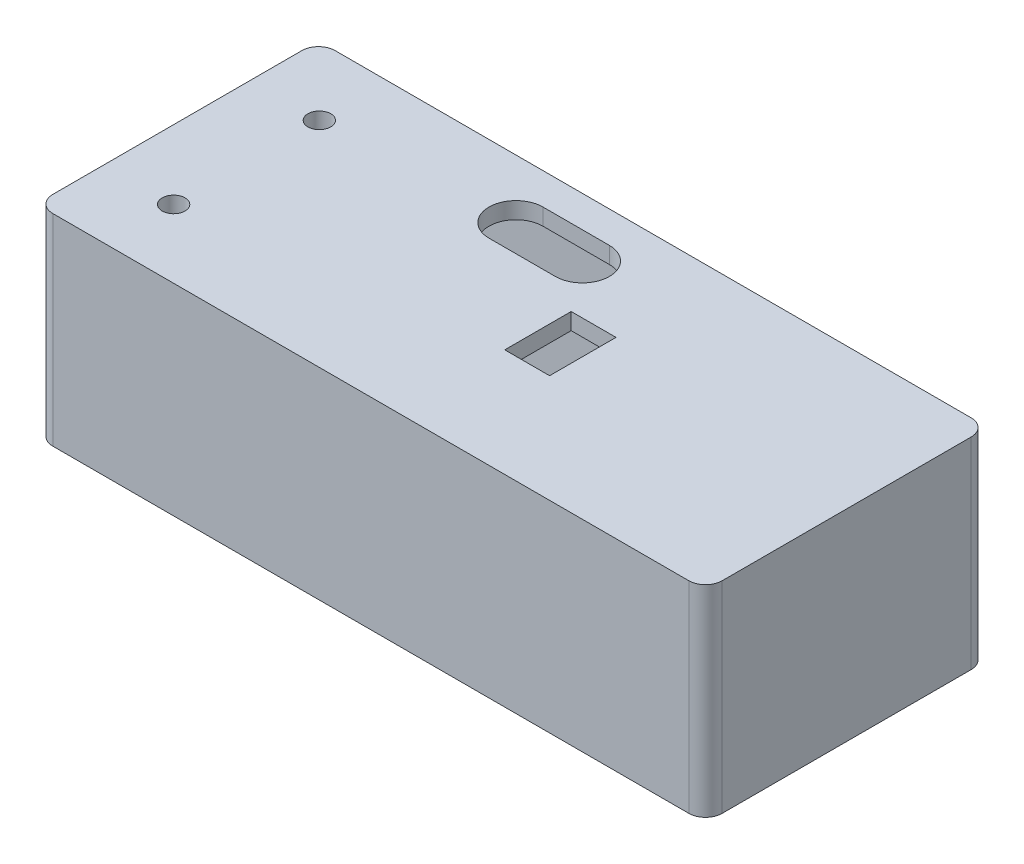
ISO-10303-21;
HEADER;
FILE_DESCRIPTION(('STEP AP214'),'2;1');
FILE_NAME('part.step','',(''),(''),'','','');
FILE_SCHEMA(('AUTOMOTIVE_DESIGN { 1 0 10303 214 1 1 1 1 }'));
ENDSEC;
DATA;
#1=APPLICATION_CONTEXT('core data for automotive mechanical design processes');
#2=APPLICATION_PROTOCOL_DEFINITION('international standard','automotive_design',2000,#1);
#3=PRODUCT_CONTEXT('',#1,'mechanical');
#4=PRODUCT('Part','Part','',(#3));
#5=PRODUCT_RELATED_PRODUCT_CATEGORY('part','',(#4));
#6=PRODUCT_DEFINITION_FORMATION('','',#4);
#7=PRODUCT_DEFINITION_CONTEXT('part definition',#1,'design');
#8=PRODUCT_DEFINITION('design','',#6,#7);
#9=PRODUCT_DEFINITION_SHAPE('','',#8);
#10=(LENGTH_UNIT() NAMED_UNIT(*) SI_UNIT(.MILLI.,.METRE.));
#11=(NAMED_UNIT(*) PLANE_ANGLE_UNIT() SI_UNIT($,.RADIAN.));
#12=(NAMED_UNIT(*) SI_UNIT($,.STERADIAN.) SOLID_ANGLE_UNIT());
#13=UNCERTAINTY_MEASURE_WITH_UNIT(LENGTH_MEASURE(1.E-05),#10,'distance_accuracy_value','');
#14=(GEOMETRIC_REPRESENTATION_CONTEXT(3) GLOBAL_UNCERTAINTY_ASSIGNED_CONTEXT((#13)) GLOBAL_UNIT_ASSIGNED_CONTEXT((#10,
#11,#12)) REPRESENTATION_CONTEXT('',''));
#15=CARTESIAN_POINT('',(0.,0.,0.));
#16=DIRECTION('',(0.,0.,1.));
#17=DIRECTION('',(1.,0.,0.));
#18=AXIS2_PLACEMENT_3D('',#15,#16,#17);
#19=CARTESIAN_POINT('',(78.2580247506416,63.7572868919868,82.4057332060762));
#20=DIRECTION('',(-1.,0.,0.));
#21=DIRECTION('',(0.,0.,1.));
#22=AXIS2_PLACEMENT_3D('',#19,#20,#21);
#23=PLANE('',#22);
#24=DIRECTION('',(0.,0.,1.));
#25=VECTOR('',#24,1.);
#26=CARTESIAN_POINT('',(78.2580247506416,41.4433868919868,78.5957332060762));
#27=LINE('',#26,#25);
#28=CARTESIAN_POINT('',(78.2580247506416,41.4433868919868,78.5957332060762));
#29=VERTEX_POINT('',#28);
#30=CARTESIAN_POINT('',(78.2580247506416,41.4433868919868,82.4057332060762));
#31=VERTEX_POINT('',#30);
#32=EDGE_CURVE('E311',#29,#31,#27,.T.);
#33=ORIENTED_EDGE('',*,*,#32,.T.);
#34=DIRECTION('',(0.,-1.,0.));
#35=VECTOR('',#34,1.);
#36=CARTESIAN_POINT('',(78.2580247506416,63.7572868919868,82.4057332060762));
#37=LINE('',#36,#35);
#38=CARTESIAN_POINT('',(78.2580247506416,63.7572868919868,82.4057332060762));
#39=VERTEX_POINT('',#38);
#40=EDGE_CURVE('E439',#39,#31,#37,.T.);
#41=ORIENTED_EDGE('',*,*,#40,.F.);
#42=DIRECTION('',(0.,0.,-1.));
#43=VECTOR('',#42,1.);
#44=CARTESIAN_POINT('',(78.2580247506416,63.7572868919868,82.4057332060762));
#45=LINE('',#44,#43);
#46=CARTESIAN_POINT('',(78.2580247506416,63.7572868919868,48.1157332060762));
#47=VERTEX_POINT('',#46);
#48=EDGE_CURVE('E407',#39,#47,#45,.T.);
#49=ORIENTED_EDGE('',*,*,#48,.T.);
#50=DIRECTION('',(0.,-1.,0.));
#51=VECTOR('',#50,1.);
#52=CARTESIAN_POINT('',(78.2580247506416,63.7572868919868,48.1157332060762));
#53=LINE('',#52,#51);
#54=CARTESIAN_POINT('',(78.2580247506416,41.4433868919868,48.1157332060762));
#55=VERTEX_POINT('',#54);
#56=EDGE_CURVE('E436',#47,#55,#53,.T.);
#57=ORIENTED_EDGE('',*,*,#56,.T.);
#58=DIRECTION('',(0.,0.,-1.));
#59=VECTOR('',#58,1.);
#60=CARTESIAN_POINT('',(78.2580247506416,41.4433868919868,51.9257332060762));
#61=LINE('',#60,#59);
#62=CARTESIAN_POINT('',(78.2580247506416,41.4433868919868,51.9257332060762));
#63=VERTEX_POINT('',#62);
#64=EDGE_CURVE('E362',#63,#55,#61,.T.);
#65=ORIENTED_EDGE('',*,*,#64,.F.);
#66=DIRECTION('',(0.,1.,0.));
#67=VECTOR('',#66,1.);
#68=CARTESIAN_POINT('',(78.2580247506416,34.4583868919868,51.9257332060762));
#69=LINE('',#68,#67);
#70=CARTESIAN_POINT('',(78.2580247506416,35.4743868919868,51.9257332060762));
#71=VERTEX_POINT('',#70);
#72=EDGE_CURVE('E337',#71,#63,#69,.T.);
#73=ORIENTED_EDGE('',*,*,#72,.F.);
#74=DIRECTION('',(0.,0.,-1.));
#75=VECTOR('',#74,1.);
#76=CARTESIAN_POINT('',(78.2580247506416,35.4743868919868,82.4057332060762));
#77=LINE('',#76,#75);
#78=CARTESIAN_POINT('',(78.2580247506416,35.4743868919868,78.5957332060762));
#79=VERTEX_POINT('',#78);
#80=EDGE_CURVE('E403',#79,#71,#77,.T.);
#81=ORIENTED_EDGE('',*,*,#80,.F.);
#82=DIRECTION('',(0.,1.,0.));
#83=VECTOR('',#82,1.);
#84=CARTESIAN_POINT('',(78.2580247506416,34.4583868919868,78.5957332060762));
#85=LINE('',#84,#83);
#86=EDGE_CURVE('E302',#79,#29,#85,.T.);
#87=ORIENTED_EDGE('',*,*,#86,.T.);
#88=EDGE_LOOP('',(#33,#41,#49,#57,#65,#73,#81,#87));
#89=FACE_BOUND('',#88,.T.);
#90=ADVANCED_FACE('F33',(#89),#23,.T.);
#91=CARTESIAN_POINT('',(-11.1719752493585,63.7572868919868,48.1157332060762));
#92=DIRECTION('',(0.,0.,1.));
#93=DIRECTION('',(1.,0.,0.));
#94=AXIS2_PLACEMENT_3D('',#91,#92,#93);
#95=PLANE('',#94);
#96=DIRECTION('',(0.,-1.,0.));
#97=VECTOR('',#96,1.);
#98=CARTESIAN_POINT('',(70.6380247506416,34.4583868919868,48.1157332060762));
#99=LINE('',#98,#97);
#100=CARTESIAN_POINT('',(70.6380247506416,41.4433868919868,48.1157332060762));
#101=VERTEX_POINT('',#100);
#102=CARTESIAN_POINT('',(70.6380247506416,35.4743868919868,48.1157332060762));
#103=VERTEX_POINT('',#102);
#104=EDGE_CURVE('E350',#101,#103,#99,.T.);
#105=ORIENTED_EDGE('',*,*,#104,.F.);
#106=DIRECTION('',(-1.,0.,0.));
#107=VECTOR('',#106,1.);
#108=CARTESIAN_POINT('',(78.2580247506416,41.4433868919868,48.1157332060762));
#109=LINE('',#108,#107);
#110=EDGE_CURVE('E346',#55,#101,#109,.T.);
#111=ORIENTED_EDGE('',*,*,#110,.F.);
#112=ORIENTED_EDGE('',*,*,#56,.F.);
#113=DIRECTION('',(-1.,0.,0.));
#114=VECTOR('',#113,1.);
#115=CARTESIAN_POINT('',(78.2580247506416,63.7572868919868,48.1157332060762));
#116=LINE('',#115,#114);
#117=CARTESIAN_POINT('',(-14.9819752493585,63.7572868919868,48.1157332060762));
#118=VERTEX_POINT('',#117);
#119=EDGE_CURVE('E411',#47,#118,#116,.T.);
#120=ORIENTED_EDGE('',*,*,#119,.T.);
#121=DIRECTION('',(0.,-1.,0.));
#122=VECTOR('',#121,1.);
#123=CARTESIAN_POINT('',(-14.9819752493585,63.7572868919868,48.1157332060762));
#124=LINE('',#123,#122);
#125=CARTESIAN_POINT('',(-14.9819752493585,35.4743868919868,48.1157332060762));
#126=VERTEX_POINT('',#125);
#127=EDGE_CURVE('E433',#118,#126,#124,.T.);
#128=ORIENTED_EDGE('',*,*,#127,.T.);
#129=DIRECTION('',(-1.,0.,0.));
#130=VECTOR('',#129,1.);
#131=CARTESIAN_POINT('',(-11.1719752493585,35.4743868919868,48.1157332060762));
#132=LINE('',#131,#130);
#133=EDGE_CURVE('E421',#103,#126,#132,.T.);
#134=ORIENTED_EDGE('',*,*,#133,.F.);
#135=EDGE_LOOP('',(#105,#111,#112,#120,#128,#134));
#136=FACE_BOUND('',#135,.T.);
#137=ADVANCED_FACE('F518',(#136),#95,.T.);
#138=CARTESIAN_POINT('',(-17.0139752493585,35.4743868919868,84.3107332060762));
#139=DIRECTION('',(0.,1.,0.));
#140=DIRECTION('',(0.,0.,1.));
#141=AXIS2_PLACEMENT_3D('',#138,#139,#140);
#142=PLANE('',#141);
#143=CARTESIAN_POINT('',(-17.0139752493585,35.4743868919868,84.3107332060762));
#144=DIRECTION('',(0.,1.,0.));
#145=DIRECTION('',(0.,0.,1.));
#146=AXIS2_PLACEMENT_3D('',#143,#144,#145);
#147=CIRCLE('',#146,2.54);
#148=CARTESIAN_POINT('',(-19.5539752493585,35.4743868919868,84.3107332060762));
#149=VERTEX_POINT('',#148);
#150=CARTESIAN_POINT('',(-17.0139752493585,35.4743868919868,86.8507332060762));
#151=VERTEX_POINT('',#150);
#152=EDGE_CURVE('E441',#149,#151,#147,.T.);
#153=ORIENTED_EDGE('',*,*,#152,.F.);
#154=DIRECTION('',(0.,0.,1.));
#155=VECTOR('',#154,1.);
#156=CARTESIAN_POINT('',(-19.5539752493585,35.4743868919868,46.2107332060762));
#157=LINE('',#156,#155);
#158=CARTESIAN_POINT('',(-19.5539752493585,35.4743868919868,46.2107332060762));
#159=VERTEX_POINT('',#158);
#160=EDGE_CURVE('E456',#159,#149,#157,.T.);
#161=ORIENTED_EDGE('',*,*,#160,.F.);
#162=CARTESIAN_POINT('',(-17.0139752493585,35.4743868919868,46.2107332060762));
#163=DIRECTION('',(0.,1.,0.));
#164=DIRECTION('',(0.,0.,1.));
#165=AXIS2_PLACEMENT_3D('',#162,#163,#164);
#166=CIRCLE('',#165,2.54);
#167=CARTESIAN_POINT('',(-17.0139752493585,35.4743868919868,43.6707332060762));
#168=VERTEX_POINT('',#167);
#169=EDGE_CURVE('E454',#168,#159,#166,.T.);
#170=ORIENTED_EDGE('',*,*,#169,.F.);
#171=DIRECTION('',(-1.,0.,0.));
#172=VECTOR('',#171,1.);
#173=CARTESIAN_POINT('',(80.2900247506415,35.4743868919868,43.6707332060762));
#174=LINE('',#173,#172);
#175=CARTESIAN_POINT('',(80.2900247506415,35.4743868919868,43.6707332060762));
#176=VERTEX_POINT('',#175);
#177=EDGE_CURVE('E452',#176,#168,#174,.T.);
#178=ORIENTED_EDGE('',*,*,#177,.F.);
#179=CARTESIAN_POINT('',(80.2900247506416,35.4743868919868,46.2107332060762));
#180=DIRECTION('',(0.,1.,0.));
#181=DIRECTION('',(0.,0.,1.));
#182=AXIS2_PLACEMENT_3D('',#179,#180,#181);
#183=CIRCLE('',#182,2.54);
#184=CARTESIAN_POINT('',(82.8300247506416,35.4743868919868,46.2107332060762));
#185=VERTEX_POINT('',#184);
#186=EDGE_CURVE('E450',#185,#176,#183,.T.);
#187=ORIENTED_EDGE('',*,*,#186,.F.);
#188=DIRECTION('',(0.,0.,-1.));
#189=VECTOR('',#188,1.);
#190=CARTESIAN_POINT('',(82.8300247506416,35.4743868919868,84.3107332060762));
#191=LINE('',#190,#189);
#192=CARTESIAN_POINT('',(82.8300247506416,35.4743868919868,84.3107332060762));
#193=VERTEX_POINT('',#192);
#194=EDGE_CURVE('E448',#193,#185,#191,.T.);
#195=ORIENTED_EDGE('',*,*,#194,.F.);
#196=CARTESIAN_POINT('',(80.2900247506416,35.4743868919868,84.3107332060762));
#197=DIRECTION('',(0.,1.,0.));
#198=DIRECTION('',(0.,0.,1.));
#199=AXIS2_PLACEMENT_3D('',#196,#197,#198);
#200=CIRCLE('',#199,2.54);
#201=CARTESIAN_POINT('',(80.2900247506416,35.4743868919868,86.8507332060762));
#202=VERTEX_POINT('',#201);
#203=EDGE_CURVE('E446',#202,#193,#200,.T.);
#204=ORIENTED_EDGE('',*,*,#203,.F.);
#205=DIRECTION('',(1.,0.,0.));
#206=VECTOR('',#205,1.);
#207=CARTESIAN_POINT('',(-17.0139752493585,35.4743868919868,86.8507332060762));
#208=LINE('',#207,#206);
#209=EDGE_CURVE('E444',#151,#202,#208,.T.);
#210=ORIENTED_EDGE('',*,*,#209,.F.);
#211=EDGE_LOOP('',(#153,#161,#170,#178,#187,#195,#204,#210));
#212=FACE_BOUND('',#211,.T.);
#213=CARTESIAN_POINT('',(78.2580247506416,35.4743868919868,82.4057332060762));
#214=VERTEX_POINT('',#213);
#215=EDGE_CURVE('E418',#214,#79,#77,.T.);
#216=ORIENTED_EDGE('',*,*,#215,.T.);
#217=ORIENTED_EDGE('',*,*,#80,.T.);
#218=DIRECTION('',(0.,0.,1.));
#219=VECTOR('',#218,1.);
#220=CARTESIAN_POINT('',(78.2580247506416,35.4743868919868,84.3107332060762));
#221=LINE('',#220,#219);
#222=CARTESIAN_POINT('',(78.2580247506416,35.4743868919868,48.1157332060762));
#223=VERTEX_POINT('',#222);
#224=EDGE_CURVE('E364',#223,#71,#221,.T.);
#225=ORIENTED_EDGE('',*,*,#224,.F.);
#226=EDGE_CURVE('E422',#223,#103,#132,.T.);
#227=ORIENTED_EDGE('',*,*,#226,.T.);
#228=ORIENTED_EDGE('',*,*,#133,.T.);
#229=DIRECTION('',(0.,0.,1.));
#230=VECTOR('',#229,1.);
#231=CARTESIAN_POINT('',(-14.9819752493585,35.4743868919868,79.4057332060762));
#232=LINE('',#231,#230);
#233=CARTESIAN_POINT('',(-14.9819752493585,35.4743868919868,82.4057332060762));
#234=VERTEX_POINT('',#233);
#235=EDGE_CURVE('E425',#126,#234,#232,.T.);
#236=ORIENTED_EDGE('',*,*,#235,.T.);
#237=DIRECTION('',(1.,0.,0.));
#238=VECTOR('',#237,1.);
#239=CARTESIAN_POINT('',(-11.1719752493585,35.4743868919868,82.4057332060762));
#240=LINE('',#239,#238);
#241=CARTESIAN_POINT('',(70.6380247506416,35.4743868919868,82.4057332060762));
#242=VERTEX_POINT('',#241);
#243=EDGE_CURVE('E408',#234,#242,#240,.T.);
#244=ORIENTED_EDGE('',*,*,#243,.T.);
#245=EDGE_CURVE('E428',#242,#214,#240,.T.);
#246=ORIENTED_EDGE('',*,*,#245,.T.);
#247=EDGE_LOOP('',(#216,#217,#225,#227,#228,#236,#244,#246));
#248=FACE_BOUND('',#247,.T.);
#249=ADVANCED_FACE('F485',(#212,#248),#142,.F.);
#250=CARTESIAN_POINT('',(-17.0139752493585,63.7572868919868,84.3107332060762));
#251=DIRECTION('',(0.,-1.,0.));
#252=DIRECTION('',(0.,0.,-1.));
#253=AXIS2_PLACEMENT_3D('',#250,#251,#252);
#254=CYLINDRICAL_SURFACE('',#253,2.54);
#255=ORIENTED_EDGE('',*,*,#152,.T.);
#256=DIRECTION('',(0.,-1.,0.));
#257=VECTOR('',#256,1.);
#258=CARTESIAN_POINT('',(-17.0139752493585,63.7572868919868,86.8507332060762));
#259=LINE('',#258,#257);
#260=CARTESIAN_POINT('',(-17.0139752493585,66.2972868919868,86.8507332060762));
#261=VERTEX_POINT('',#260);
#262=EDGE_CURVE('E11',#261,#151,#259,.T.);
#263=ORIENTED_EDGE('',*,*,#262,.F.);
#264=CARTESIAN_POINT('',(-17.0139752493585,66.2972868919868,84.3107332060762));
#265=DIRECTION('',(0.,1.,0.));
#266=DIRECTION('',(0.,0.,1.));
#267=AXIS2_PLACEMENT_3D('',#264,#265,#266);
#268=CIRCLE('',#267,2.54);
#269=CARTESIAN_POINT('',(-19.5539752493585,66.2972868919868,84.3107332060762));
#270=VERTEX_POINT('',#269);
#271=EDGE_CURVE('E375',#270,#261,#268,.T.);
#272=ORIENTED_EDGE('',*,*,#271,.F.);
#273=DIRECTION('',(0.,-1.,0.));
#274=VECTOR('',#273,1.);
#275=CARTESIAN_POINT('',(-19.5539752493585,63.7572868919868,84.3107332060762));
#276=LINE('',#275,#274);
#277=EDGE_CURVE('E458',#270,#149,#276,.T.);
#278=ORIENTED_EDGE('',*,*,#277,.T.);
#279=EDGE_LOOP('',(#255,#263,#272,#278));
#280=FACE_BOUND('',#279,.T.);
#281=ADVANCED_FACE('F35',(#280),#254,.T.);
#282=CARTESIAN_POINT('',(-17.0139752493585,63.7572868919868,86.8507332060762));
#283=DIRECTION('',(0.,0.,-1.));
#284=DIRECTION('',(-1.,0.,0.));
#285=AXIS2_PLACEMENT_3D('',#282,#283,#284);
#286=PLANE('',#285);
#287=ORIENTED_EDGE('',*,*,#209,.T.);
#288=DIRECTION('',(0.,-1.,0.));
#289=VECTOR('',#288,1.);
#290=CARTESIAN_POINT('',(80.2900247506416,63.7572868919868,86.8507332060762));
#291=LINE('',#290,#289);
#292=CARTESIAN_POINT('',(80.2900247506416,66.2972868919868,86.8507332060762));
#293=VERTEX_POINT('',#292);
#294=EDGE_CURVE('E41',#293,#202,#291,.T.);
#295=ORIENTED_EDGE('',*,*,#294,.F.);
#296=DIRECTION('',(1.,0.,0.));
#297=VECTOR('',#296,1.);
#298=CARTESIAN_POINT('',(-17.0139752493585,66.2972868919868,86.8507332060762));
#299=LINE('',#298,#297);
#300=EDGE_CURVE('E382',#261,#293,#299,.T.);
#301=ORIENTED_EDGE('',*,*,#300,.F.);
#302=ORIENTED_EDGE('',*,*,#262,.T.);
#303=EDGE_LOOP('',(#287,#295,#301,#302));
#304=FACE_BOUND('',#303,.T.);
#305=ADVANCED_FACE('F510',(#304),#286,.F.);
#306=CARTESIAN_POINT('',(80.2900247506416,63.7572868919868,84.3107332060762));
#307=DIRECTION('',(0.,-1.,0.));
#308=DIRECTION('',(0.,0.,-1.));
#309=AXIS2_PLACEMENT_3D('',#306,#307,#308);
#310=CYLINDRICAL_SURFACE('',#309,2.54);
#311=ORIENTED_EDGE('',*,*,#203,.T.);
#312=DIRECTION('',(0.,-1.,0.));
#313=VECTOR('',#312,1.);
#314=CARTESIAN_POINT('',(82.8300247506416,63.7572868919868,84.3107332060762));
#315=LINE('',#314,#313);
#316=CARTESIAN_POINT('',(82.8300247506416,66.2972868919868,84.3107332060762));
#317=VERTEX_POINT('',#316);
#318=EDGE_CURVE('E473',#317,#193,#315,.T.);
#319=ORIENTED_EDGE('',*,*,#318,.F.);
#320=CARTESIAN_POINT('',(80.2900247506416,66.2972868919868,84.3107332060762));
#321=DIRECTION('',(0.,1.,0.));
#322=DIRECTION('',(0.,0.,1.));
#323=AXIS2_PLACEMENT_3D('',#320,#321,#322);
#324=CIRCLE('',#323,2.54);
#325=EDGE_CURVE('E385',#293,#317,#324,.T.);
#326=ORIENTED_EDGE('',*,*,#325,.F.);
#327=ORIENTED_EDGE('',*,*,#294,.T.);
#328=EDGE_LOOP('',(#311,#319,#326,#327));
#329=FACE_BOUND('',#328,.T.);
#330=ADVANCED_FACE('F479',(#329),#310,.T.);
#331=CARTESIAN_POINT('',(82.8300247506416,63.7572868919868,84.3107332060762));
#332=DIRECTION('',(-1.,0.,0.));
#333=DIRECTION('',(0.,0.,1.));
#334=AXIS2_PLACEMENT_3D('',#331,#332,#333);
#335=PLANE('',#334);
#336=ORIENTED_EDGE('',*,*,#194,.T.);
#337=DIRECTION('',(0.,-1.,0.));
#338=VECTOR('',#337,1.);
#339=CARTESIAN_POINT('',(82.8300247506416,63.7572868919868,46.2107332060762));
#340=LINE('',#339,#338);
#341=CARTESIAN_POINT('',(82.8300247506416,66.2972868919868,46.2107332060762));
#342=VERTEX_POINT('',#341);
#343=EDGE_CURVE('E470',#342,#185,#340,.T.);
#344=ORIENTED_EDGE('',*,*,#343,.F.);
#345=DIRECTION('',(0.,0.,-1.));
#346=VECTOR('',#345,1.);
#347=CARTESIAN_POINT('',(82.8300247506416,66.2972868919868,84.3107332060762));
#348=LINE('',#347,#346);
#349=EDGE_CURVE('E388',#317,#342,#348,.T.);
#350=ORIENTED_EDGE('',*,*,#349,.F.);
#351=ORIENTED_EDGE('',*,*,#318,.T.);
#352=EDGE_LOOP('',(#336,#344,#350,#351));
#353=FACE_BOUND('',#352,.T.);
#354=ADVANCED_FACE('F490',(#353),#335,.F.);
#355=CARTESIAN_POINT('',(80.2900247506416,63.7572868919868,46.2107332060762));
#356=DIRECTION('',(0.,-1.,0.));
#357=DIRECTION('',(0.,0.,-1.));
#358=AXIS2_PLACEMENT_3D('',#355,#356,#357);
#359=CYLINDRICAL_SURFACE('',#358,2.54);
#360=ORIENTED_EDGE('',*,*,#186,.T.);
#361=DIRECTION('',(0.,-1.,0.));
#362=VECTOR('',#361,1.);
#363=CARTESIAN_POINT('',(80.2900247506415,63.7572868919868,43.6707332060762));
#364=LINE('',#363,#362);
#365=CARTESIAN_POINT('',(80.2900247506415,66.2972868919868,43.6707332060762));
#366=VERTEX_POINT('',#365);
#367=EDGE_CURVE('E467',#366,#176,#364,.T.);
#368=ORIENTED_EDGE('',*,*,#367,.F.);
#369=CARTESIAN_POINT('',(80.2900247506416,66.2972868919868,46.2107332060762));
#370=DIRECTION('',(0.,1.,0.));
#371=DIRECTION('',(0.,0.,1.));
#372=AXIS2_PLACEMENT_3D('',#369,#370,#371);
#373=CIRCLE('',#372,2.54);
#374=EDGE_CURVE('E391',#342,#366,#373,.T.);
#375=ORIENTED_EDGE('',*,*,#374,.F.);
#376=ORIENTED_EDGE('',*,*,#343,.T.);
#377=EDGE_LOOP('',(#360,#368,#375,#376));
#378=FACE_BOUND('',#377,.T.);
#379=ADVANCED_FACE('F494',(#378),#359,.T.);
#380=CARTESIAN_POINT('',(80.2900247506415,63.7572868919868,43.6707332060762));
#381=DIRECTION('',(0.,0.,1.));
#382=DIRECTION('',(1.,0.,0.));
#383=AXIS2_PLACEMENT_3D('',#380,#381,#382);
#384=PLANE('',#383);
#385=ORIENTED_EDGE('',*,*,#177,.T.);
#386=DIRECTION('',(0.,-1.,0.));
#387=VECTOR('',#386,1.);
#388=CARTESIAN_POINT('',(-17.0139752493585,63.7572868919868,43.6707332060762));
#389=LINE('',#388,#387);
#390=CARTESIAN_POINT('',(-17.0139752493585,66.2972868919868,43.6707332060762));
#391=VERTEX_POINT('',#390);
#392=EDGE_CURVE('E464',#391,#168,#389,.T.);
#393=ORIENTED_EDGE('',*,*,#392,.F.);
#394=DIRECTION('',(-1.,0.,0.));
#395=VECTOR('',#394,1.);
#396=CARTESIAN_POINT('',(80.2900247506415,66.2972868919868,43.6707332060762));
#397=LINE('',#396,#395);
#398=EDGE_CURVE('E394',#366,#391,#397,.T.);
#399=ORIENTED_EDGE('',*,*,#398,.F.);
#400=ORIENTED_EDGE('',*,*,#367,.T.);
#401=EDGE_LOOP('',(#385,#393,#399,#400));
#402=FACE_BOUND('',#401,.T.);
#403=ADVANCED_FACE('F500',(#402),#384,.F.);
#404=CARTESIAN_POINT('',(-17.0139752493585,63.7572868919868,46.2107332060762));
#405=DIRECTION('',(0.,-1.,0.));
#406=DIRECTION('',(0.,0.,-1.));
#407=AXIS2_PLACEMENT_3D('',#404,#405,#406);
#408=CYLINDRICAL_SURFACE('',#407,2.54);
#409=ORIENTED_EDGE('',*,*,#169,.T.);
#410=DIRECTION('',(0.,-1.,0.));
#411=VECTOR('',#410,1.);
#412=CARTESIAN_POINT('',(-19.5539752493585,63.7572868919868,46.2107332060762));
#413=LINE('',#412,#411);
#414=CARTESIAN_POINT('',(-19.5539752493585,66.2972868919868,46.2107332060762));
#415=VERTEX_POINT('',#414);
#416=EDGE_CURVE('E461',#415,#159,#413,.T.);
#417=ORIENTED_EDGE('',*,*,#416,.F.);
#418=CARTESIAN_POINT('',(-17.0139752493585,66.2972868919868,46.2107332060762));
#419=DIRECTION('',(0.,1.,0.));
#420=DIRECTION('',(0.,0.,1.));
#421=AXIS2_PLACEMENT_3D('',#418,#419,#420);
#422=CIRCLE('',#421,2.54);
#423=EDGE_CURVE('E397',#391,#415,#422,.T.);
#424=ORIENTED_EDGE('',*,*,#423,.F.);
#425=ORIENTED_EDGE('',*,*,#392,.T.);
#426=EDGE_LOOP('',(#409,#417,#424,#425));
#427=FACE_BOUND('',#426,.T.);
#428=ADVANCED_FACE('F503',(#427),#408,.T.);
#429=CARTESIAN_POINT('',(-19.5539752493585,63.7572868919868,46.2107332060762));
#430=DIRECTION('',(1.,0.,0.));
#431=DIRECTION('',(0.,0.,-1.));
#432=AXIS2_PLACEMENT_3D('',#429,#430,#431);
#433=PLANE('',#432);
#434=ORIENTED_EDGE('',*,*,#160,.T.);
#435=ORIENTED_EDGE('',*,*,#277,.F.);
#436=DIRECTION('',(0.,0.,1.));
#437=VECTOR('',#436,1.);
#438=CARTESIAN_POINT('',(-19.5539752493585,66.2972868919868,46.2107332060762));
#439=LINE('',#438,#437);
#440=EDGE_CURVE('E400',#415,#270,#439,.T.);
#441=ORIENTED_EDGE('',*,*,#440,.F.);
#442=ORIENTED_EDGE('',*,*,#416,.T.);
#443=EDGE_LOOP('',(#434,#435,#441,#442));
#444=FACE_BOUND('',#443,.T.);
#445=ADVANCED_FACE('F506',(#444),#433,.F.);
#446=CARTESIAN_POINT('',(-14.9819752493585,63.7572868919868,79.4057332060762));
#447=DIRECTION('',(1.,0.,0.));
#448=DIRECTION('',(0.,0.,-1.));
#449=AXIS2_PLACEMENT_3D('',#446,#447,#448);
#450=PLANE('',#449);
#451=ORIENTED_EDGE('',*,*,#235,.F.);
#452=ORIENTED_EDGE('',*,*,#127,.F.);
#453=DIRECTION('',(0.,0.,1.));
#454=VECTOR('',#453,1.);
#455=CARTESIAN_POINT('',(-14.9819752493585,63.7572868919868,48.1157332060762));
#456=LINE('',#455,#454);
#457=CARTESIAN_POINT('',(-14.9819752493585,63.7572868919868,82.4057332060762));
#458=VERTEX_POINT('',#457);
#459=EDGE_CURVE('E414',#118,#458,#456,.T.);
#460=ORIENTED_EDGE('',*,*,#459,.T.);
#461=DIRECTION('',(0.,-1.,0.));
#462=VECTOR('',#461,1.);
#463=CARTESIAN_POINT('',(-14.9819752493585,63.7572868919868,82.4057332060762));
#464=LINE('',#463,#462);
#465=EDGE_CURVE('E417',#458,#234,#464,.T.);
#466=ORIENTED_EDGE('',*,*,#465,.T.);
#467=EDGE_LOOP('',(#451,#452,#460,#466));
#468=FACE_BOUND('',#467,.T.);
#469=ADVANCED_FACE('F532',(#468),#450,.T.);
#470=CARTESIAN_POINT('',(-11.1719752493585,63.7572868919868,82.4057332060762));
#471=DIRECTION('',(0.,0.,-1.));
#472=DIRECTION('',(-1.,0.,0.));
#473=AXIS2_PLACEMENT_3D('',#470,#471,#472);
#474=PLANE('',#473);
#475=DIRECTION('',(0.,-1.,0.));
#476=VECTOR('',#475,1.);
#477=CARTESIAN_POINT('',(70.6380247506416,34.4583868919868,82.4057332060762));
#478=LINE('',#477,#476);
#479=CARTESIAN_POINT('',(70.6380247506416,41.4433868919868,82.4057332060762));
#480=VERTEX_POINT('',#479);
#481=EDGE_CURVE('E318',#480,#242,#478,.T.);
#482=ORIENTED_EDGE('',*,*,#481,.T.);
#483=ORIENTED_EDGE('',*,*,#243,.F.);
#484=ORIENTED_EDGE('',*,*,#465,.F.);
#485=DIRECTION('',(1.,0.,0.));
#486=VECTOR('',#485,1.);
#487=CARTESIAN_POINT('',(-6.79197524935846,63.7572868919868,82.4057332060762));
#488=LINE('',#487,#486);
#489=EDGE_CURVE('E404',#458,#39,#488,.T.);
#490=ORIENTED_EDGE('',*,*,#489,.T.);
#491=ORIENTED_EDGE('',*,*,#40,.T.);
#492=DIRECTION('',(-1.,0.,0.));
#493=VECTOR('',#492,1.);
#494=CARTESIAN_POINT('',(78.2580247506416,41.4433868919868,82.4057332060762));
#495=LINE('',#494,#493);
#496=EDGE_CURVE('E320',#31,#480,#495,.T.);
#497=ORIENTED_EDGE('',*,*,#496,.T.);
#498=EDGE_LOOP('',(#482,#483,#484,#490,#491,#497));
#499=FACE_BOUND('',#498,.T.);
#500=ADVANCED_FACE('F566',(#499),#474,.T.);
#501=CARTESIAN_POINT('',(-17.0139752493585,63.7572868919868,84.3107332060762));
#502=DIRECTION('',(0.,1.,0.));
#503=DIRECTION('',(0.,0.,1.));
#504=AXIS2_PLACEMENT_3D('',#501,#502,#503);
#505=PLANE('',#504);
#506=DIRECTION('',(-1.,0.,0.));
#507=VECTOR('',#506,1.);
#508=CARTESIAN_POINT('',(29.7680247506415,63.7572868919868,56.7517332060762));
#509=LINE('',#508,#507);
#510=CARTESIAN_POINT('',(29.7680247506415,63.7572868919868,56.7517332060762));
#511=VERTEX_POINT('',#510);
#512=CARTESIAN_POINT('',(19.6080247506415,63.7572868919868,56.7517332060762));
#513=VERTEX_POINT('',#512);
#514=EDGE_CURVE('E250',#511,#513,#509,.T.);
#515=ORIENTED_EDGE('',*,*,#514,.F.);
#516=CARTESIAN_POINT('',(29.7680247506415,63.7572868919868,52.6242332060762));
#517=DIRECTION('',(0.,1.,0.));
#518=DIRECTION('',(0.,0.,1.));
#519=AXIS2_PLACEMENT_3D('',#516,#517,#518);
#520=CIRCLE('',#519,4.12749999999999);
#521=CARTESIAN_POINT('',(29.7680247506415,63.7572868919868,48.4967332060762));
#522=VERTEX_POINT('',#521);
#523=EDGE_CURVE('E232',#522,#511,#520,.F.);
#524=ORIENTED_EDGE('',*,*,#523,.F.);
#525=DIRECTION('',(1.,0.,0.));
#526=VECTOR('',#525,1.);
#527=CARTESIAN_POINT('',(29.7680247506415,63.7572868919868,48.4967332060762));
#528=LINE('',#527,#526);
#529=CARTESIAN_POINT('',(19.6080247506415,63.7572868919868,48.4967332060762));
#530=VERTEX_POINT('',#529);
#531=EDGE_CURVE('E241',#530,#522,#528,.T.);
#532=ORIENTED_EDGE('',*,*,#531,.F.);
#533=CARTESIAN_POINT('',(19.6080247506415,63.7572868919868,52.6242332060762));
#534=DIRECTION('',(0.,1.,0.));
#535=DIRECTION('',(0.,0.,1.));
#536=AXIS2_PLACEMENT_3D('',#533,#534,#535);
#537=CIRCLE('',#536,4.1275);
#538=EDGE_CURVE('E48',#513,#530,#537,.F.);
#539=ORIENTED_EDGE('',*,*,#538,.F.);
#540=EDGE_LOOP('',(#515,#524,#532,#539));
#541=FACE_BOUND('',#540,.T.);
#542=DIRECTION('',(1.,0.,0.));
#543=VECTOR('',#542,1.);
#544=CARTESIAN_POINT('',(35.6100246586415,63.7572868919868,60.1807332060762));
#545=LINE('',#544,#543);
#546=CARTESIAN_POINT('',(35.6100246586415,63.7572868919868,60.1807332060762));
#547=VERTEX_POINT('',#546);
#548=CARTESIAN_POINT('',(42.4680247506415,63.7572868919868,60.1807332060762));
#549=VERTEX_POINT('',#548);
#550=EDGE_CURVE('E268',#547,#549,#545,.T.);
#551=ORIENTED_EDGE('',*,*,#550,.F.);
#552=DIRECTION('',(0.,0.,-1.));
#553=VECTOR('',#552,1.);
#554=CARTESIAN_POINT('',(35.6100246586415,63.7572868919868,60.1807332060762));
#555=LINE('',#554,#553);
#556=CARTESIAN_POINT('',(35.6100246586415,63.7572868919868,70.3407332060762));
#557=VERTEX_POINT('',#556);
#558=EDGE_CURVE('E271',#557,#547,#555,.T.);
#559=ORIENTED_EDGE('',*,*,#558,.F.);
#560=DIRECTION('',(-1.,0.,0.));
#561=VECTOR('',#560,1.);
#562=CARTESIAN_POINT('',(35.6100246586415,63.7572868919868,70.3407332060762));
#563=LINE('',#562,#561);
#564=CARTESIAN_POINT('',(42.4680247506415,63.7572868919868,70.3407332060762));
#565=VERTEX_POINT('',#564);
#566=EDGE_CURVE('E288',#565,#557,#563,.T.);
#567=ORIENTED_EDGE('',*,*,#566,.F.);
#568=DIRECTION('',(0.,0.,1.));
#569=VECTOR('',#568,1.);
#570=CARTESIAN_POINT('',(42.4680247506415,63.7572868919868,60.1807332060762));
#571=LINE('',#570,#569);
#572=EDGE_CURVE('E244',#549,#565,#571,.T.);
#573=ORIENTED_EDGE('',*,*,#572,.F.);
#574=EDGE_LOOP('',(#551,#559,#567,#573));
#575=FACE_BOUND('',#574,.T.);
#576=CARTESIAN_POINT('',(-8.98197524935846,63.7572868919868,54.1157332060762));
#577=DIRECTION('',(0.,1.,0.));
#578=DIRECTION('',(0.,0.,1.));
#579=AXIS2_PLACEMENT_3D('',#576,#577,#578);
#580=CIRCLE('',#579,1.75);
#581=CARTESIAN_POINT('',(-8.98197524935846,63.7572868919868,55.8657332060762));
#582=VERTEX_POINT('',#581);
#583=EDGE_CURVE('E371',#582,#582,#580,.F.);
#584=ORIENTED_EDGE('',*,*,#583,.F.);
#585=EDGE_LOOP('',(#584));
#586=FACE_BOUND('',#585,.T.);
#587=CARTESIAN_POINT('',(-8.98197524935846,63.7572868919868,76.4057332060762));
#588=DIRECTION('',(0.,1.,0.));
#589=DIRECTION('',(0.,0.,1.));
#590=AXIS2_PLACEMENT_3D('',#587,#588,#589);
#591=CIRCLE('',#590,1.75);
#592=CARTESIAN_POINT('',(-8.98197524935846,63.7572868919868,78.1557332060762));
#593=VERTEX_POINT('',#592);
#594=EDGE_CURVE('E372',#593,#593,#591,.F.);
#595=ORIENTED_EDGE('',*,*,#594,.F.);
#596=EDGE_LOOP('',(#595));
#597=FACE_BOUND('',#596,.T.);
#598=ORIENTED_EDGE('',*,*,#119,.F.);
#599=ORIENTED_EDGE('',*,*,#48,.F.);
#600=ORIENTED_EDGE('',*,*,#489,.F.);
#601=ORIENTED_EDGE('',*,*,#459,.F.);
#602=EDGE_LOOP('',(#598,#599,#600,#601));
#603=FACE_BOUND('',#602,.T.);
#604=ADVANCED_FACE('F247',(#541,#575,#586,#597,#603),#505,.F.);
#605=CARTESIAN_POINT('',(-17.0139752493585,66.2972868919868,84.3107332060762));
#606=DIRECTION('',(0.,1.,0.));
#607=DIRECTION('',(0.,0.,1.));
#608=AXIS2_PLACEMENT_3D('',#605,#606,#607);
#609=PLANE('',#608);
#610=CARTESIAN_POINT('',(29.7680247506415,66.2972868919868,52.6242332060762));
#611=DIRECTION('',(0.,1.,0.));
#612=DIRECTION('',(0.,0.,1.));
#613=AXIS2_PLACEMENT_3D('',#610,#611,#612);
#614=CIRCLE('',#613,4.12749999999999);
#615=CARTESIAN_POINT('',(29.7680247506415,66.2972868919868,56.7517332060762));
#616=VERTEX_POINT('',#615);
#617=CARTESIAN_POINT('',(29.7680247506415,66.2972868919868,48.4967332060762));
#618=VERTEX_POINT('',#617);
#619=EDGE_CURVE('E56',#616,#618,#614,.T.);
#620=ORIENTED_EDGE('',*,*,#619,.F.);
#621=DIRECTION('',(1.,0.,0.));
#622=VECTOR('',#621,1.);
#623=CARTESIAN_POINT('',(29.7680247506415,66.2972868919868,56.7517332060762));
#624=LINE('',#623,#622);
#625=CARTESIAN_POINT('',(19.6080247506415,66.2972868919868,56.7517332060762));
#626=VERTEX_POINT('',#625);
#627=EDGE_CURVE('E238',#626,#616,#624,.T.);
#628=ORIENTED_EDGE('',*,*,#627,.F.);
#629=CARTESIAN_POINT('',(19.6080247506415,66.2972868919868,52.6242332060762));
#630=DIRECTION('',(0.,1.,0.));
#631=DIRECTION('',(0.,0.,1.));
#632=AXIS2_PLACEMENT_3D('',#629,#630,#631);
#633=CIRCLE('',#632,4.1275);
#634=CARTESIAN_POINT('',(19.6080247506415,66.2972868919868,48.4967332060762));
#635=VERTEX_POINT('',#634);
#636=EDGE_CURVE('E258',#635,#626,#633,.T.);
#637=ORIENTED_EDGE('',*,*,#636,.F.);
#638=DIRECTION('',(-1.,0.,0.));
#639=VECTOR('',#638,1.);
#640=CARTESIAN_POINT('',(29.7680247506415,66.2972868919868,48.4967332060762));
#641=LINE('',#640,#639);
#642=EDGE_CURVE('E252',#618,#635,#641,.T.);
#643=ORIENTED_EDGE('',*,*,#642,.F.);
#644=EDGE_LOOP('',(#620,#628,#637,#643));
#645=FACE_BOUND('',#644,.T.);
#646=DIRECTION('',(0.,0.,1.));
#647=VECTOR('',#646,1.);
#648=CARTESIAN_POINT('',(35.6100246586415,66.2972868919868,60.1807332060762));
#649=LINE('',#648,#647);
#650=CARTESIAN_POINT('',(35.6100246586415,66.2972868919868,60.1807332060762));
#651=VERTEX_POINT('',#650);
#652=CARTESIAN_POINT('',(35.6100246586415,66.2972868919868,70.3407332060762));
#653=VERTEX_POINT('',#652);
#654=EDGE_CURVE('E274',#651,#653,#649,.T.);
#655=ORIENTED_EDGE('',*,*,#654,.F.);
#656=DIRECTION('',(-1.,0.,0.));
#657=VECTOR('',#656,1.);
#658=CARTESIAN_POINT('',(35.6100246586415,66.2972868919868,60.1807332060762));
#659=LINE('',#658,#657);
#660=CARTESIAN_POINT('',(42.4680247506415,66.2972868919868,60.1807332060762));
#661=VERTEX_POINT('',#660);
#662=EDGE_CURVE('E282',#661,#651,#659,.T.);
#663=ORIENTED_EDGE('',*,*,#662,.F.);
#664=DIRECTION('',(0.,0.,-1.));
#665=VECTOR('',#664,1.);
#666=CARTESIAN_POINT('',(42.4680247506415,66.2972868919868,60.1807332060762));
#667=LINE('',#666,#665);
#668=CARTESIAN_POINT('',(42.4680247506415,66.2972868919868,70.3407332060762));
#669=VERTEX_POINT('',#668);
#670=EDGE_CURVE('E279',#669,#661,#667,.T.);
#671=ORIENTED_EDGE('',*,*,#670,.F.);
#672=DIRECTION('',(1.,0.,0.));
#673=VECTOR('',#672,1.);
#674=CARTESIAN_POINT('',(35.6100246586415,66.2972868919868,70.3407332060762));
#675=LINE('',#674,#673);
#676=EDGE_CURVE('E276',#653,#669,#675,.T.);
#677=ORIENTED_EDGE('',*,*,#676,.F.);
#678=EDGE_LOOP('',(#655,#663,#671,#677));
#679=FACE_BOUND('',#678,.T.);
#680=CARTESIAN_POINT('',(-8.98197524935846,66.2972868919868,54.1157332060762));
#681=DIRECTION('',(0.,1.,0.));
#682=DIRECTION('',(0.,0.,1.));
#683=AXIS2_PLACEMENT_3D('',#680,#681,#682);
#684=CIRCLE('',#683,1.75);
#685=CARTESIAN_POINT('',(-8.98197524935846,66.2972868919868,55.8657332060762));
#686=VERTEX_POINT('',#685);
#687=EDGE_CURVE('E368',#686,#686,#684,.T.);
#688=ORIENTED_EDGE('',*,*,#687,.F.);
#689=EDGE_LOOP('',(#688));
#690=FACE_BOUND('',#689,.T.);
#691=CARTESIAN_POINT('',(-8.98197524935846,66.2972868919868,76.4057332060762));
#692=DIRECTION('',(0.,1.,0.));
#693=DIRECTION('',(0.,0.,1.));
#694=AXIS2_PLACEMENT_3D('',#691,#692,#693);
#695=CIRCLE('',#694,1.75);
#696=CARTESIAN_POINT('',(-8.98197524935846,66.2972868919868,78.1557332060762));
#697=VERTEX_POINT('',#696);
#698=EDGE_CURVE('E367',#697,#697,#695,.T.);
#699=ORIENTED_EDGE('',*,*,#698,.F.);
#700=EDGE_LOOP('',(#699));
#701=FACE_BOUND('',#700,.T.);
#702=ORIENTED_EDGE('',*,*,#271,.T.);
#703=ORIENTED_EDGE('',*,*,#300,.T.);
#704=ORIENTED_EDGE('',*,*,#325,.T.);
#705=ORIENTED_EDGE('',*,*,#349,.T.);
#706=ORIENTED_EDGE('',*,*,#374,.T.);
#707=ORIENTED_EDGE('',*,*,#398,.T.);
#708=ORIENTED_EDGE('',*,*,#423,.T.);
#709=ORIENTED_EDGE('',*,*,#440,.T.);
#710=EDGE_LOOP('',(#702,#703,#704,#705,#706,#707,#708,#709));
#711=FACE_BOUND('',#710,.T.);
#712=ADVANCED_FACE('F497',(#645,#679,#690,#701,#711),#609,.T.);
#713=CARTESIAN_POINT('',(-8.98197524935846,35.4733868919868,76.4057332060762));
#714=DIRECTION('',(0.,1.,0.));
#715=DIRECTION('',(0.,0.,1.));
#716=AXIS2_PLACEMENT_3D('',#713,#714,#715);
#717=CYLINDRICAL_SURFACE('',#716,1.75);
#718=ORIENTED_EDGE('',*,*,#698,.T.);
#719=EDGE_LOOP('',(#718));
#720=FACE_BOUND('',#719,.T.);
#721=ORIENTED_EDGE('',*,*,#594,.T.);
#722=EDGE_LOOP('',(#721));
#723=FACE_BOUND('',#722,.T.);
#724=ADVANCED_FACE('F590',(#720,#723),#717,.F.);
#725=CARTESIAN_POINT('',(-8.98197524935846,35.4733868919868,54.1157332060762));
#726=DIRECTION('',(0.,1.,0.));
#727=DIRECTION('',(0.,0.,1.));
#728=AXIS2_PLACEMENT_3D('',#725,#726,#727);
#729=CYLINDRICAL_SURFACE('',#728,1.75);
#730=ORIENTED_EDGE('',*,*,#687,.T.);
#731=EDGE_LOOP('',(#730));
#732=FACE_BOUND('',#731,.T.);
#733=ORIENTED_EDGE('',*,*,#583,.T.);
#734=EDGE_LOOP('',(#733));
#735=FACE_BOUND('',#734,.T.);
#736=ADVANCED_FACE('F598',(#732,#735),#729,.F.);
#737=CARTESIAN_POINT('',(0.,0.,48.1157332060762));
#738=DIRECTION('',(0.,0.,1.));
#739=DIRECTION('',(1.,0.,0.));
#740=AXIS2_PLACEMENT_3D('',#737,#738,#739);
#741=PLANE('',#740);
#742=CARTESIAN_POINT('',(70.6380247506416,34.4583868919868,48.1157332060762));
#743=VERTEX_POINT('',#742);
#744=EDGE_CURVE('E349',#103,#743,#99,.T.);
#745=ORIENTED_EDGE('',*,*,#744,.F.);
#746=ORIENTED_EDGE('',*,*,#226,.F.);
#747=DIRECTION('',(0.,1.,0.));
#748=VECTOR('',#747,1.);
#749=CARTESIAN_POINT('',(78.2580247506416,34.4583868919868,48.1157332060762));
#750=LINE('',#749,#748);
#751=CARTESIAN_POINT('',(78.2580247506416,34.4583868919868,48.1157332060762));
#752=VERTEX_POINT('',#751);
#753=EDGE_CURVE('E332',#752,#223,#750,.T.);
#754=ORIENTED_EDGE('',*,*,#753,.F.);
#755=DIRECTION('',(1.,0.,0.));
#756=VECTOR('',#755,1.);
#757=CARTESIAN_POINT('',(78.2580247506416,34.4583868919868,48.1157332060762));
#758=LINE('',#757,#756);
#759=EDGE_CURVE('E353',#743,#752,#758,.T.);
#760=ORIENTED_EDGE('',*,*,#759,.F.);
#761=EDGE_LOOP('',(#745,#746,#754,#760));
#762=FACE_BOUND('',#761,.T.);
#763=ADVANCED_FACE('F606',(#762),#741,.F.);
#764=CARTESIAN_POINT('',(78.2580247506416,34.4583868919868,51.9257332060762));
#765=DIRECTION('',(-1.,0.,0.));
#766=DIRECTION('',(0.,0.,1.));
#767=AXIS2_PLACEMENT_3D('',#764,#765,#766);
#768=PLANE('',#767);
#769=ORIENTED_EDGE('',*,*,#753,.T.);
#770=ORIENTED_EDGE('',*,*,#224,.T.);
#771=CARTESIAN_POINT('',(78.2580247506416,34.4583868919868,51.9257332060762));
#772=VERTEX_POINT('',#771);
#773=EDGE_CURVE('E333',#772,#71,#69,.T.);
#774=ORIENTED_EDGE('',*,*,#773,.F.);
#775=DIRECTION('',(0.,0.,-1.));
#776=VECTOR('',#775,1.);
#777=CARTESIAN_POINT('',(78.2580247506416,34.4583868919868,51.9257332060762));
#778=LINE('',#777,#776);
#779=EDGE_CURVE('E343',#772,#752,#778,.T.);
#780=ORIENTED_EDGE('',*,*,#779,.T.);
#781=EDGE_LOOP('',(#769,#770,#774,#780));
#782=FACE_BOUND('',#781,.T.);
#783=ADVANCED_FACE('F615',(#782),#768,.F.);
#784=CARTESIAN_POINT('',(78.2580247506416,41.4433868919868,51.9257332060762));
#785=DIRECTION('',(0.,-1.,0.));
#786=DIRECTION('',(0.,0.,-1.));
#787=AXIS2_PLACEMENT_3D('',#784,#785,#786);
#788=PLANE('',#787);
#789=ORIENTED_EDGE('',*,*,#110,.T.);
#790=DIRECTION('',(0.,0.,-1.));
#791=VECTOR('',#790,1.);
#792=CARTESIAN_POINT('',(70.6380247506416,41.4433868919868,51.9257332060762));
#793=LINE('',#792,#791);
#794=CARTESIAN_POINT('',(70.6380247506416,41.4433868919868,51.9257332060762));
#795=VERTEX_POINT('',#794);
#796=EDGE_CURVE('E360',#795,#101,#793,.T.);
#797=ORIENTED_EDGE('',*,*,#796,.F.);
#798=DIRECTION('',(-1.,0.,0.));
#799=VECTOR('',#798,1.);
#800=CARTESIAN_POINT('',(78.2580247506416,41.4433868919868,51.9257332060762));
#801=LINE('',#800,#799);
#802=EDGE_CURVE('E336',#63,#795,#801,.T.);
#803=ORIENTED_EDGE('',*,*,#802,.F.);
#804=ORIENTED_EDGE('',*,*,#64,.T.);
#805=EDGE_LOOP('',(#789,#797,#803,#804));
#806=FACE_BOUND('',#805,.T.);
#807=ADVANCED_FACE('F623',(#806),#788,.F.);
#808=CARTESIAN_POINT('',(70.6380247506416,34.4583868919868,51.9257332060762));
#809=DIRECTION('',(1.,0.,0.));
#810=DIRECTION('',(0.,0.,-1.));
#811=AXIS2_PLACEMENT_3D('',#808,#809,#810);
#812=PLANE('',#811);
#813=ORIENTED_EDGE('',*,*,#104,.T.);
#814=ORIENTED_EDGE('',*,*,#744,.T.);
#815=DIRECTION('',(0.,0.,-1.));
#816=VECTOR('',#815,1.);
#817=CARTESIAN_POINT('',(70.6380247506416,34.4583868919868,51.9257332060762));
#818=LINE('',#817,#816);
#819=CARTESIAN_POINT('',(70.6380247506416,34.4583868919868,51.9257332060762));
#820=VERTEX_POINT('',#819);
#821=EDGE_CURVE('E357',#820,#743,#818,.T.);
#822=ORIENTED_EDGE('',*,*,#821,.F.);
#823=DIRECTION('',(0.,-1.,0.));
#824=VECTOR('',#823,1.);
#825=CARTESIAN_POINT('',(70.6380247506416,34.4583868919868,51.9257332060762));
#826=LINE('',#825,#824);
#827=EDGE_CURVE('E339',#795,#820,#826,.T.);
#828=ORIENTED_EDGE('',*,*,#827,.F.);
#829=ORIENTED_EDGE('',*,*,#796,.T.);
#830=EDGE_LOOP('',(#813,#814,#822,#828,#829));
#831=FACE_BOUND('',#830,.T.);
#832=ADVANCED_FACE('F631',(#831),#812,.F.);
#833=CARTESIAN_POINT('',(78.2580247506416,34.4583868919868,51.9257332060762));
#834=DIRECTION('',(0.,1.,0.));
#835=DIRECTION('',(0.,0.,1.));
#836=AXIS2_PLACEMENT_3D('',#833,#834,#835);
#837=PLANE('',#836);
#838=ORIENTED_EDGE('',*,*,#759,.T.);
#839=ORIENTED_EDGE('',*,*,#779,.F.);
#840=DIRECTION('',(1.,0.,0.));
#841=VECTOR('',#840,1.);
#842=CARTESIAN_POINT('',(78.2580247506416,34.4583868919868,51.9257332060762));
#843=LINE('',#842,#841);
#844=EDGE_CURVE('E341',#820,#772,#843,.T.);
#845=ORIENTED_EDGE('',*,*,#844,.F.);
#846=ORIENTED_EDGE('',*,*,#821,.T.);
#847=EDGE_LOOP('',(#838,#839,#845,#846));
#848=FACE_BOUND('',#847,.T.);
#849=ADVANCED_FACE('F639',(#848),#837,.F.);
#850=CARTESIAN_POINT('',(0.,0.,51.9257332060762));
#851=DIRECTION('',(0.,0.,1.));
#852=DIRECTION('',(1.,0.,0.));
#853=AXIS2_PLACEMENT_3D('',#850,#851,#852);
#854=PLANE('',#853);
#855=ORIENTED_EDGE('',*,*,#773,.T.);
#856=ORIENTED_EDGE('',*,*,#72,.T.);
#857=ORIENTED_EDGE('',*,*,#802,.T.);
#858=ORIENTED_EDGE('',*,*,#827,.T.);
#859=ORIENTED_EDGE('',*,*,#844,.T.);
#860=EDGE_LOOP('',(#855,#856,#857,#858,#859));
#861=FACE_BOUND('',#860,.T.);
#862=ADVANCED_FACE('F647',(#861),#854,.T.);
#863=CARTESIAN_POINT('',(0.,0.,82.4057332060762));
#864=DIRECTION('',(0.,0.,-1.));
#865=DIRECTION('',(1.,0.,0.));
#866=AXIS2_PLACEMENT_3D('',#863,#864,#865);
#867=PLANE('',#866);
#868=DIRECTION('',(0.,1.,0.));
#869=VECTOR('',#868,1.);
#870=CARTESIAN_POINT('',(78.2580247506416,34.4583868919868,82.4057332060762));
#871=LINE('',#870,#869);
#872=CARTESIAN_POINT('',(78.2580247506416,34.4583868919868,82.4057332060762));
#873=VERTEX_POINT('',#872);
#874=EDGE_CURVE('E297',#873,#214,#871,.T.);
#875=ORIENTED_EDGE('',*,*,#874,.T.);
#876=ORIENTED_EDGE('',*,*,#245,.F.);
#877=CARTESIAN_POINT('',(70.6380247506416,34.4583868919868,82.4057332060762));
#878=VERTEX_POINT('',#877);
#879=EDGE_CURVE('E317',#242,#878,#478,.T.);
#880=ORIENTED_EDGE('',*,*,#879,.T.);
#881=DIRECTION('',(1.,0.,0.));
#882=VECTOR('',#881,1.);
#883=CARTESIAN_POINT('',(78.2580247506416,34.4583868919868,82.4057332060762));
#884=LINE('',#883,#882);
#885=EDGE_CURVE('E314',#878,#873,#884,.T.);
#886=ORIENTED_EDGE('',*,*,#885,.T.);
#887=EDGE_LOOP('',(#875,#876,#880,#886));
#888=FACE_BOUND('',#887,.T.);
#889=ADVANCED_FACE('F655',(#888),#867,.F.);
#890=CARTESIAN_POINT('',(78.2580247506416,34.4583868919868,78.5957332060762));
#891=DIRECTION('',(1.,0.,0.));
#892=DIRECTION('',(0.,0.,-1.));
#893=AXIS2_PLACEMENT_3D('',#890,#891,#892);
#894=PLANE('',#893);
#895=ORIENTED_EDGE('',*,*,#215,.F.);
#896=ORIENTED_EDGE('',*,*,#874,.F.);
#897=DIRECTION('',(0.,0.,1.));
#898=VECTOR('',#897,1.);
#899=CARTESIAN_POINT('',(78.2580247506416,34.4583868919868,78.5957332060762));
#900=LINE('',#899,#898);
#901=CARTESIAN_POINT('',(78.2580247506416,34.4583868919868,78.5957332060762));
#902=VERTEX_POINT('',#901);
#903=EDGE_CURVE('E330',#902,#873,#900,.T.);
#904=ORIENTED_EDGE('',*,*,#903,.F.);
#905=EDGE_CURVE('E298',#902,#79,#85,.T.);
#906=ORIENTED_EDGE('',*,*,#905,.T.);
#907=EDGE_LOOP('',(#895,#896,#904,#906));
#908=FACE_BOUND('',#907,.T.);
#909=ADVANCED_FACE('F662',(#908),#894,.T.);
#910=CARTESIAN_POINT('',(78.2580247506416,34.4583868919868,78.5957332060762));
#911=DIRECTION('',(0.,-1.,0.));
#912=DIRECTION('',(0.,0.,-1.));
#913=AXIS2_PLACEMENT_3D('',#910,#911,#912);
#914=PLANE('',#913);
#915=ORIENTED_EDGE('',*,*,#885,.F.);
#916=DIRECTION('',(0.,0.,1.));
#917=VECTOR('',#916,1.);
#918=CARTESIAN_POINT('',(70.6380247506416,34.4583868919868,78.5957332060762));
#919=LINE('',#918,#917);
#920=CARTESIAN_POINT('',(70.6380247506416,34.4583868919868,78.5957332060762));
#921=VERTEX_POINT('',#920);
#922=EDGE_CURVE('E327',#921,#878,#919,.T.);
#923=ORIENTED_EDGE('',*,*,#922,.F.);
#924=DIRECTION('',(1.,0.,0.));
#925=VECTOR('',#924,1.);
#926=CARTESIAN_POINT('',(78.2580247506416,34.4583868919868,78.5957332060762));
#927=LINE('',#926,#925);
#928=EDGE_CURVE('E301',#921,#902,#927,.T.);
#929=ORIENTED_EDGE('',*,*,#928,.T.);
#930=ORIENTED_EDGE('',*,*,#903,.T.);
#931=EDGE_LOOP('',(#915,#923,#929,#930));
#932=FACE_BOUND('',#931,.T.);
#933=ADVANCED_FACE('F670',(#932),#914,.T.);
#934=CARTESIAN_POINT('',(70.6380247506416,34.4583868919868,78.5957332060762));
#935=DIRECTION('',(-1.,0.,0.));
#936=DIRECTION('',(0.,0.,1.));
#937=AXIS2_PLACEMENT_3D('',#934,#935,#936);
#938=PLANE('',#937);
#939=ORIENTED_EDGE('',*,*,#481,.F.);
#940=DIRECTION('',(0.,0.,1.));
#941=VECTOR('',#940,1.);
#942=CARTESIAN_POINT('',(70.6380247506416,41.4433868919868,78.5957332060762));
#943=LINE('',#942,#941);
#944=CARTESIAN_POINT('',(70.6380247506416,41.4433868919868,78.5957332060762));
#945=VERTEX_POINT('',#944);
#946=EDGE_CURVE('E324',#945,#480,#943,.T.);
#947=ORIENTED_EDGE('',*,*,#946,.F.);
#948=DIRECTION('',(0.,-1.,0.));
#949=VECTOR('',#948,1.);
#950=CARTESIAN_POINT('',(70.6380247506416,34.4583868919868,78.5957332060762));
#951=LINE('',#950,#949);
#952=EDGE_CURVE('E305',#945,#921,#951,.T.);
#953=ORIENTED_EDGE('',*,*,#952,.T.);
#954=ORIENTED_EDGE('',*,*,#922,.T.);
#955=ORIENTED_EDGE('',*,*,#879,.F.);
#956=EDGE_LOOP('',(#939,#947,#953,#954,#955));
#957=FACE_BOUND('',#956,.T.);
#958=ADVANCED_FACE('F678',(#957),#938,.T.);
#959=CARTESIAN_POINT('',(78.2580247506416,41.4433868919868,78.5957332060762));
#960=DIRECTION('',(0.,1.,0.));
#961=DIRECTION('',(0.,0.,1.));
#962=AXIS2_PLACEMENT_3D('',#959,#960,#961);
#963=PLANE('',#962);
#964=ORIENTED_EDGE('',*,*,#496,.F.);
#965=ORIENTED_EDGE('',*,*,#32,.F.);
#966=DIRECTION('',(-1.,0.,0.));
#967=VECTOR('',#966,1.);
#968=CARTESIAN_POINT('',(78.2580247506416,41.4433868919868,78.5957332060762));
#969=LINE('',#968,#967);
#970=EDGE_CURVE('E308',#29,#945,#969,.T.);
#971=ORIENTED_EDGE('',*,*,#970,.T.);
#972=ORIENTED_EDGE('',*,*,#946,.T.);
#973=EDGE_LOOP('',(#964,#965,#971,#972));
#974=FACE_BOUND('',#973,.T.);
#975=ADVANCED_FACE('F686',(#974),#963,.T.);
#976=CARTESIAN_POINT('',(0.,0.,78.5957332060762));
#977=DIRECTION('',(0.,0.,-1.));
#978=DIRECTION('',(1.,0.,0.));
#979=AXIS2_PLACEMENT_3D('',#976,#977,#978);
#980=PLANE('',#979);
#981=ORIENTED_EDGE('',*,*,#905,.F.);
#982=ORIENTED_EDGE('',*,*,#928,.F.);
#983=ORIENTED_EDGE('',*,*,#952,.F.);
#984=ORIENTED_EDGE('',*,*,#970,.F.);
#985=ORIENTED_EDGE('',*,*,#86,.F.);
#986=EDGE_LOOP('',(#981,#982,#983,#984,#985));
#987=FACE_BOUND('',#986,.T.);
#988=ADVANCED_FACE('F694',(#987),#980,.T.);
#989=CARTESIAN_POINT('',(35.6100246586415,34.4573868919868,60.1807332060762));
#990=DIRECTION('',(-1.,0.,0.));
#991=DIRECTION('',(0.,0.,1.));
#992=AXIS2_PLACEMENT_3D('',#989,#990,#991);
#993=PLANE('',#992);
#994=ORIENTED_EDGE('',*,*,#558,.T.);
#995=DIRECTION('',(0.,1.,0.));
#996=VECTOR('',#995,1.);
#997=CARTESIAN_POINT('',(35.6100246586415,34.4573868919868,60.1807332060762));
#998=LINE('',#997,#996);
#999=EDGE_CURVE('E286',#547,#651,#998,.T.);
#1000=ORIENTED_EDGE('',*,*,#999,.T.);
#1001=ORIENTED_EDGE('',*,*,#654,.T.);
#1002=DIRECTION('',(0.,1.,0.));
#1003=VECTOR('',#1002,1.);
#1004=CARTESIAN_POINT('',(35.6100246586415,34.4573868919868,70.3407332060762));
#1005=LINE('',#1004,#1003);
#1006=EDGE_CURVE('E285',#557,#653,#1005,.T.);
#1007=ORIENTED_EDGE('',*,*,#1006,.F.);
#1008=EDGE_LOOP('',(#994,#1000,#1001,#1007));
#1009=FACE_BOUND('',#1008,.T.);
#1010=ADVANCED_FACE('F702',(#1009),#993,.F.);
#1011=CARTESIAN_POINT('',(35.6100246586415,34.4573868919868,60.1807332060762));
#1012=DIRECTION('',(0.,0.,-1.));
#1013=DIRECTION('',(-1.,0.,0.));
#1014=AXIS2_PLACEMENT_3D('',#1011,#1012,#1013);
#1015=PLANE('',#1014);
#1016=ORIENTED_EDGE('',*,*,#550,.T.);
#1017=DIRECTION('',(0.,1.,0.));
#1018=VECTOR('',#1017,1.);
#1019=CARTESIAN_POINT('',(42.4680247506415,34.4573868919868,60.1807332060762));
#1020=LINE('',#1019,#1018);
#1021=EDGE_CURVE('E289',#549,#661,#1020,.T.);
#1022=ORIENTED_EDGE('',*,*,#1021,.T.);
#1023=ORIENTED_EDGE('',*,*,#662,.T.);
#1024=ORIENTED_EDGE('',*,*,#999,.F.);
#1025=EDGE_LOOP('',(#1016,#1022,#1023,#1024));
#1026=FACE_BOUND('',#1025,.T.);
#1027=ADVANCED_FACE('F710',(#1026),#1015,.F.);
#1028=CARTESIAN_POINT('',(42.4680247506415,34.4573868919868,60.1807332060762));
#1029=DIRECTION('',(1.,0.,0.));
#1030=DIRECTION('',(0.,0.,-1.));
#1031=AXIS2_PLACEMENT_3D('',#1028,#1029,#1030);
#1032=PLANE('',#1031);
#1033=ORIENTED_EDGE('',*,*,#572,.T.);
#1034=DIRECTION('',(0.,1.,0.));
#1035=VECTOR('',#1034,1.);
#1036=CARTESIAN_POINT('',(42.4680247506415,34.4573868919868,70.3407332060762));
#1037=LINE('',#1036,#1035);
#1038=EDGE_CURVE('E291',#565,#669,#1037,.T.);
#1039=ORIENTED_EDGE('',*,*,#1038,.T.);
#1040=ORIENTED_EDGE('',*,*,#670,.T.);
#1041=ORIENTED_EDGE('',*,*,#1021,.F.);
#1042=EDGE_LOOP('',(#1033,#1039,#1040,#1041));
#1043=FACE_BOUND('',#1042,.T.);
#1044=ADVANCED_FACE('F718',(#1043),#1032,.F.);
#1045=CARTESIAN_POINT('',(35.6100246586415,34.4573868919868,70.3407332060762));
#1046=DIRECTION('',(0.,0.,1.));
#1047=DIRECTION('',(1.,0.,0.));
#1048=AXIS2_PLACEMENT_3D('',#1045,#1046,#1047);
#1049=PLANE('',#1048);
#1050=ORIENTED_EDGE('',*,*,#566,.T.);
#1051=ORIENTED_EDGE('',*,*,#1006,.T.);
#1052=ORIENTED_EDGE('',*,*,#676,.T.);
#1053=ORIENTED_EDGE('',*,*,#1038,.F.);
#1054=EDGE_LOOP('',(#1050,#1051,#1052,#1053));
#1055=FACE_BOUND('',#1054,.T.);
#1056=ADVANCED_FACE('F726',(#1055),#1049,.F.);
#1057=CARTESIAN_POINT('',(29.7680247506415,34.4573868919868,52.6242332060762));
#1058=DIRECTION('',(0.,1.,0.));
#1059=DIRECTION('',(0.,0.,1.));
#1060=AXIS2_PLACEMENT_3D('',#1057,#1058,#1059);
#1061=CYLINDRICAL_SURFACE('',#1060,4.12749999999999);
#1062=ORIENTED_EDGE('',*,*,#523,.T.);
#1063=DIRECTION('',(0.,1.,0.));
#1064=VECTOR('',#1063,1.);
#1065=CARTESIAN_POINT('',(29.7680247506415,34.4573868919868,56.7517332060762));
#1066=LINE('',#1065,#1064);
#1067=EDGE_CURVE('E245',#511,#616,#1066,.T.);
#1068=ORIENTED_EDGE('',*,*,#1067,.T.);
#1069=ORIENTED_EDGE('',*,*,#619,.T.);
#1070=DIRECTION('',(0.,1.,0.));
#1071=VECTOR('',#1070,1.);
#1072=CARTESIAN_POINT('',(29.7680247506415,34.4573868919868,48.4967332060762));
#1073=LINE('',#1072,#1071);
#1074=EDGE_CURVE('E228',#522,#618,#1073,.T.);
#1075=ORIENTED_EDGE('',*,*,#1074,.F.);
#1076=EDGE_LOOP('',(#1062,#1068,#1069,#1075));
#1077=FACE_BOUND('',#1076,.T.);
#1078=ADVANCED_FACE('F230',(#1077),#1061,.F.);
#1079=CARTESIAN_POINT('',(29.7680247506415,34.4573868919868,56.7517332060762));
#1080=DIRECTION('',(0.,0.,1.));
#1081=DIRECTION('',(1.,0.,0.));
#1082=AXIS2_PLACEMENT_3D('',#1079,#1080,#1081);
#1083=PLANE('',#1082);
#1084=ORIENTED_EDGE('',*,*,#514,.T.);
#1085=DIRECTION('',(0.,1.,0.));
#1086=VECTOR('',#1085,1.);
#1087=CARTESIAN_POINT('',(19.6080247506415,34.4573868919868,56.7517332060762));
#1088=LINE('',#1087,#1086);
#1089=EDGE_CURVE('E264',#513,#626,#1088,.T.);
#1090=ORIENTED_EDGE('',*,*,#1089,.T.);
#1091=ORIENTED_EDGE('',*,*,#627,.T.);
#1092=ORIENTED_EDGE('',*,*,#1067,.F.);
#1093=EDGE_LOOP('',(#1084,#1090,#1091,#1092));
#1094=FACE_BOUND('',#1093,.T.);
#1095=ADVANCED_FACE('F739',(#1094),#1083,.F.);
#1096=CARTESIAN_POINT('',(19.6080247506415,34.4573868919868,52.6242332060762));
#1097=DIRECTION('',(0.,1.,0.));
#1098=DIRECTION('',(0.,0.,1.));
#1099=AXIS2_PLACEMENT_3D('',#1096,#1097,#1098);
#1100=CYLINDRICAL_SURFACE('',#1099,4.1275);
#1101=ORIENTED_EDGE('',*,*,#538,.T.);
#1102=DIRECTION('',(0.,1.,0.));
#1103=VECTOR('',#1102,1.);
#1104=CARTESIAN_POINT('',(19.6080247506415,34.4573868919868,48.4967332060762));
#1105=LINE('',#1104,#1103);
#1106=EDGE_CURVE('E237',#530,#635,#1105,.T.);
#1107=ORIENTED_EDGE('',*,*,#1106,.T.);
#1108=ORIENTED_EDGE('',*,*,#636,.T.);
#1109=ORIENTED_EDGE('',*,*,#1089,.F.);
#1110=EDGE_LOOP('',(#1101,#1107,#1108,#1109));
#1111=FACE_BOUND('',#1110,.T.);
#1112=ADVANCED_FACE('F746',(#1111),#1100,.F.);
#1113=CARTESIAN_POINT('',(29.7680247506415,34.4573868919868,48.4967332060762));
#1114=DIRECTION('',(0.,0.,-1.));
#1115=DIRECTION('',(-1.,0.,0.));
#1116=AXIS2_PLACEMENT_3D('',#1113,#1114,#1115);
#1117=PLANE('',#1116);
#1118=ORIENTED_EDGE('',*,*,#531,.T.);
#1119=ORIENTED_EDGE('',*,*,#1074,.T.);
#1120=ORIENTED_EDGE('',*,*,#642,.T.);
#1121=ORIENTED_EDGE('',*,*,#1106,.F.);
#1122=EDGE_LOOP('',(#1118,#1119,#1120,#1121));
#1123=FACE_BOUND('',#1122,.T.);
#1124=ADVANCED_FACE('F242',(#1123),#1117,.F.);
#1125=CLOSED_SHELL('',(#90,#137,#249,#281,#305,#330,#354,#379,#403,#428,#445,#469,#500,#604,
#712,#724,#736,#763,#783,#807,#832,#849,#862,#889,#909,#933,#958,#975,#988,#1010,#1027,#1044,
#1056,#1078,#1095,#1112,#1124));
#1126=MANIFOLD_SOLID_BREP('B2',#1125);
#1127=ADVANCED_BREP_SHAPE_REPRESENTATION('',(#18,#1126),#14);
#1128=SHAPE_DEFINITION_REPRESENTATION(#9,#1127);
ENDSEC;
END-ISO-10303-21;
